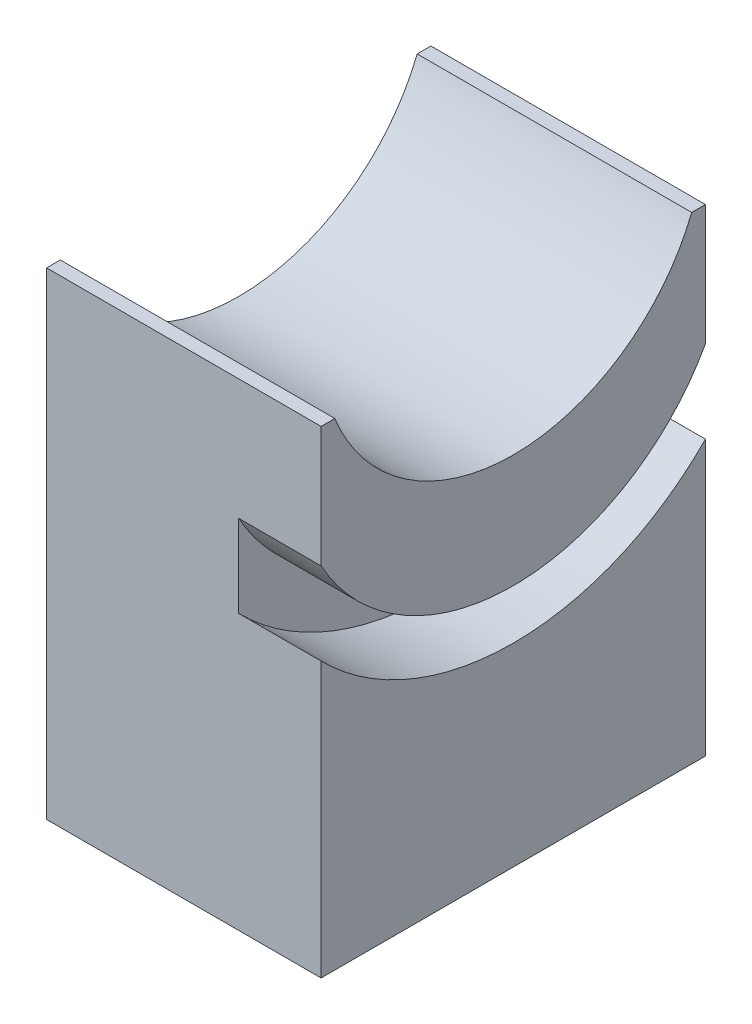
ISO-10303-21;
HEADER;
FILE_DESCRIPTION(('STEP AP214'),'2;1');
FILE_NAME('part.step','',(''),(''),'','','');
FILE_SCHEMA(('AUTOMOTIVE_DESIGN { 1 0 10303 214 1 1 1 1 }'));
ENDSEC;
DATA;
#1=APPLICATION_CONTEXT('core data for automotive mechanical design processes');
#2=APPLICATION_PROTOCOL_DEFINITION('international standard','automotive_design',2000,#1);
#3=PRODUCT_CONTEXT('',#1,'mechanical');
#4=PRODUCT('Part','Part','',(#3));
#5=PRODUCT_RELATED_PRODUCT_CATEGORY('part','',(#4));
#6=PRODUCT_DEFINITION_FORMATION('','',#4);
#7=PRODUCT_DEFINITION_CONTEXT('part definition',#1,'design');
#8=PRODUCT_DEFINITION('design','',#6,#7);
#9=PRODUCT_DEFINITION_SHAPE('','',#8);
#10=(LENGTH_UNIT() NAMED_UNIT(*) SI_UNIT(.MILLI.,.METRE.));
#11=(NAMED_UNIT(*) PLANE_ANGLE_UNIT() SI_UNIT($,.RADIAN.));
#12=(NAMED_UNIT(*) SI_UNIT($,.STERADIAN.) SOLID_ANGLE_UNIT());
#13=UNCERTAINTY_MEASURE_WITH_UNIT(LENGTH_MEASURE(1.E-05),#10,'distance_accuracy_value','');
#14=(GEOMETRIC_REPRESENTATION_CONTEXT(3) GLOBAL_UNCERTAINTY_ASSIGNED_CONTEXT((#13)) GLOBAL_UNIT_ASSIGNED_CONTEXT((#10,
#11,#12)) REPRESENTATION_CONTEXT('',''));
#15=CARTESIAN_POINT('',(0.,0.,0.));
#16=DIRECTION('',(0.,0.,1.));
#17=DIRECTION('',(1.,0.,0.));
#18=AXIS2_PLACEMENT_3D('',#15,#16,#17);
#19=CARTESIAN_POINT('',(0.,40.,14.));
#20=DIRECTION('',(-1.,0.,0.));
#21=DIRECTION('',(0.,0.,1.));
#22=AXIS2_PLACEMENT_3D('',#19,#20,#21);
#23=PLANE('',#22);
#24=DIRECTION('',(0.,-1.,0.));
#25=VECTOR('',#24,1.);
#26=CARTESIAN_POINT('',(0.,34.8038475772934,28.));
#27=LINE('',#26,#25);
#28=CARTESIAN_POINT('',(0.,34.8038475772934,28.));
#29=VERTEX_POINT('',#28);
#30=CARTESIAN_POINT('',(0.,26.,28.));
#31=VERTEX_POINT('',#30);
#32=EDGE_CURVE('E112',#29,#31,#27,.T.);
#33=ORIENTED_EDGE('',*,*,#32,.T.);
#34=CARTESIAN_POINT('',(0.,33.7459666924148,14.));
#35=DIRECTION('',(-1.,0.,0.));
#36=DIRECTION('',(0.,0.,-1.));
#37=AXIS2_PLACEMENT_3D('',#34,#35,#36);
#38=CIRCLE('',#37,16.);
#39=CARTESIAN_POINT('',(0.,26.,0.));
#40=VERTEX_POINT('',#39);
#41=EDGE_CURVE('E162',#40,#31,#38,.T.);
#42=ORIENTED_EDGE('',*,*,#41,.F.);
#43=DIRECTION('',(0.,1.,0.));
#44=VECTOR('',#43,1.);
#45=CARTESIAN_POINT('',(0.,34.8038475772934,0.));
#46=LINE('',#45,#44);
#47=CARTESIAN_POINT('',(0.,34.8038475772934,0.));
#48=VERTEX_POINT('',#47);
#49=EDGE_CURVE('E139',#40,#48,#46,.T.);
#50=ORIENTED_EDGE('',*,*,#49,.T.);
#51=DIRECTION('',(0.,0.,1.));
#52=VECTOR('',#51,1.);
#53=CARTESIAN_POINT('',(0.,34.8038475772934,1.));
#54=LINE('',#53,#52);
#55=CARTESIAN_POINT('',(0.,34.8038475772934,0.999999999999999));
#56=VERTEX_POINT('',#55);
#57=EDGE_CURVE('E138',#48,#56,#54,.T.);
#58=ORIENTED_EDGE('',*,*,#57,.T.);
#59=CARTESIAN_POINT('',(0.,40.,14.));
#60=DIRECTION('',(-1.,0.,0.));
#61=DIRECTION('',(0.,0.,1.));
#62=AXIS2_PLACEMENT_3D('',#59,#60,#61);
#63=CIRCLE('',#62,14.);
#64=CARTESIAN_POINT('',(0.,34.8038475772934,27.));
#65=VERTEX_POINT('',#64);
#66=EDGE_CURVE('E142',#56,#65,#63,.T.);
#67=ORIENTED_EDGE('',*,*,#66,.T.);
#68=DIRECTION('',(0.,0.,1.));
#69=VECTOR('',#68,1.);
#70=CARTESIAN_POINT('',(0.,34.8038475772934,27.));
#71=LINE('',#70,#69);
#72=EDGE_CURVE('E145',#65,#29,#71,.T.);
#73=ORIENTED_EDGE('',*,*,#72,.T.);
#74=EDGE_LOOP('',(#33,#42,#50,#58,#67,#73));
#75=FACE_BOUND('',#74,.T.);
#76=ADVANCED_FACE('F33',(#75),#23,.F.);
#77=CARTESIAN_POINT('',(-20.,34.8038475772934,0.));
#78=DIRECTION('',(0.,0.,-1.));
#79=DIRECTION('',(0.,1.,0.));
#80=AXIS2_PLACEMENT_3D('',#77,#78,#79);
#81=PLANE('',#80);
#82=DIRECTION('',(1.,0.,0.));
#83=VECTOR('',#82,1.);
#84=CARTESIAN_POINT('',(-6.,26.,0.));
#85=LINE('',#84,#83);
#86=CARTESIAN_POINT('',(-6.,26.,0.));
#87=VERTEX_POINT('',#86);
#88=EDGE_CURVE('E163',#87,#40,#85,.T.);
#89=ORIENTED_EDGE('',*,*,#88,.F.);
#90=DIRECTION('',(0.,1.,0.));
#91=VECTOR('',#90,1.);
#92=CARTESIAN_POINT('',(-6.,26.,0.));
#93=LINE('',#92,#91);
#94=CARTESIAN_POINT('',(-6.,20.,0.));
#95=VERTEX_POINT('',#94);
#96=EDGE_CURVE('E178',#95,#87,#93,.T.);
#97=ORIENTED_EDGE('',*,*,#96,.F.);
#98=DIRECTION('',(1.,0.,0.));
#99=VECTOR('',#98,1.);
#100=CARTESIAN_POINT('',(-6.,20.,0.));
#101=LINE('',#100,#99);
#102=CARTESIAN_POINT('',(0.,20.,0.));
#103=VERTEX_POINT('',#102);
#104=EDGE_CURVE('E165',#95,#103,#101,.T.);
#105=ORIENTED_EDGE('',*,*,#104,.T.);
#106=CARTESIAN_POINT('',(0.,0.,0.));
#107=VERTEX_POINT('',#106);
#108=EDGE_CURVE('E135',#107,#103,#46,.T.);
#109=ORIENTED_EDGE('',*,*,#108,.F.);
#110=DIRECTION('',(1.,0.,0.));
#111=VECTOR('',#110,1.);
#112=CARTESIAN_POINT('',(-20.,0.,0.));
#113=LINE('',#112,#111);
#114=CARTESIAN_POINT('',(-20.,0.,0.));
#115=VERTEX_POINT('',#114);
#116=EDGE_CURVE('E11',#115,#107,#113,.T.);
#117=ORIENTED_EDGE('',*,*,#116,.F.);
#118=DIRECTION('',(0.,1.,0.));
#119=VECTOR('',#118,1.);
#120=CARTESIAN_POINT('',(-20.,34.8038475772934,0.));
#121=LINE('',#120,#119);
#122=CARTESIAN_POINT('',(-20.,34.8038475772934,0.));
#123=VERTEX_POINT('',#122);
#124=EDGE_CURVE('E151',#115,#123,#121,.T.);
#125=ORIENTED_EDGE('',*,*,#124,.T.);
#126=DIRECTION('',(1.,0.,0.));
#127=VECTOR('',#126,1.);
#128=CARTESIAN_POINT('',(-20.,34.8038475772934,0.));
#129=LINE('',#128,#127);
#130=EDGE_CURVE('E37',#123,#48,#129,.T.);
#131=ORIENTED_EDGE('',*,*,#130,.T.);
#132=ORIENTED_EDGE('',*,*,#49,.F.);
#133=EDGE_LOOP('',(#89,#97,#105,#109,#117,#125,#131,#132));
#134=FACE_BOUND('',#133,.T.);
#135=ADVANCED_FACE('F35',(#134),#81,.T.);
#136=CARTESIAN_POINT('',(-20.,0.,0.));
#137=DIRECTION('',(0.,-1.,0.));
#138=DIRECTION('',(0.,0.,-1.));
#139=AXIS2_PLACEMENT_3D('',#136,#137,#138);
#140=PLANE('',#139);
#141=DIRECTION('',(0.,0.,-1.));
#142=VECTOR('',#141,1.);
#143=CARTESIAN_POINT('',(0.,0.,0.));
#144=LINE('',#143,#142);
#145=CARTESIAN_POINT('',(0.,0.,28.));
#146=VERTEX_POINT('',#145);
#147=EDGE_CURVE('E149',#146,#107,#144,.T.);
#148=ORIENTED_EDGE('',*,*,#147,.F.);
#149=DIRECTION('',(1.,0.,0.));
#150=VECTOR('',#149,1.);
#151=CARTESIAN_POINT('',(-20.,0.,28.));
#152=LINE('',#151,#150);
#153=CARTESIAN_POINT('',(-20.,0.,28.));
#154=VERTEX_POINT('',#153);
#155=EDGE_CURVE('E42',#154,#146,#152,.T.);
#156=ORIENTED_EDGE('',*,*,#155,.F.);
#157=DIRECTION('',(0.,0.,-1.));
#158=VECTOR('',#157,1.);
#159=CARTESIAN_POINT('',(-20.,0.,0.));
#160=LINE('',#159,#158);
#161=EDGE_CURVE('E125',#154,#115,#160,.T.);
#162=ORIENTED_EDGE('',*,*,#161,.T.);
#163=ORIENTED_EDGE('',*,*,#116,.T.);
#164=EDGE_LOOP('',(#148,#156,#162,#163));
#165=FACE_BOUND('',#164,.T.);
#166=ADVANCED_FACE('F213',(#165),#140,.T.);
#167=CARTESIAN_POINT('',(-20.,34.8038475772934,28.));
#168=DIRECTION('',(0.,0.,1.));
#169=DIRECTION('',(0.,-1.,0.));
#170=AXIS2_PLACEMENT_3D('',#167,#168,#169);
#171=PLANE('',#170);
#172=DIRECTION('',(1.,0.,0.));
#173=VECTOR('',#172,1.);
#174=CARTESIAN_POINT('',(-6.,26.,28.));
#175=LINE('',#174,#173);
#176=CARTESIAN_POINT('',(-6.,26.,28.));
#177=VERTEX_POINT('',#176);
#178=EDGE_CURVE('E176',#177,#31,#175,.T.);
#179=ORIENTED_EDGE('',*,*,#178,.T.);
#180=ORIENTED_EDGE('',*,*,#32,.F.);
#181=DIRECTION('',(1.,0.,0.));
#182=VECTOR('',#181,1.);
#183=CARTESIAN_POINT('',(-20.,34.8038475772934,28.));
#184=LINE('',#183,#182);
#185=CARTESIAN_POINT('',(-20.,34.8038475772934,28.));
#186=VERTEX_POINT('',#185);
#187=EDGE_CURVE('E104',#186,#29,#184,.T.);
#188=ORIENTED_EDGE('',*,*,#187,.F.);
#189=DIRECTION('',(0.,-1.,0.));
#190=VECTOR('',#189,1.);
#191=CARTESIAN_POINT('',(-20.,34.8038475772934,28.));
#192=LINE('',#191,#190);
#193=EDGE_CURVE('E109',#186,#154,#192,.T.);
#194=ORIENTED_EDGE('',*,*,#193,.T.);
#195=ORIENTED_EDGE('',*,*,#155,.T.);
#196=CARTESIAN_POINT('',(0.,20.,28.));
#197=VERTEX_POINT('',#196);
#198=EDGE_CURVE('E147',#197,#146,#27,.T.);
#199=ORIENTED_EDGE('',*,*,#198,.F.);
#200=DIRECTION('',(1.,0.,0.));
#201=VECTOR('',#200,1.);
#202=CARTESIAN_POINT('',(-6.,20.,28.));
#203=LINE('',#202,#201);
#204=CARTESIAN_POINT('',(-6.,20.,28.));
#205=VERTEX_POINT('',#204);
#206=EDGE_CURVE('E50',#205,#197,#203,.T.);
#207=ORIENTED_EDGE('',*,*,#206,.F.);
#208=DIRECTION('',(0.,-1.,0.));
#209=VECTOR('',#208,1.);
#210=CARTESIAN_POINT('',(-6.,20.,28.));
#211=LINE('',#210,#209);
#212=EDGE_CURVE('E202',#177,#205,#211,.T.);
#213=ORIENTED_EDGE('',*,*,#212,.F.);
#214=EDGE_LOOP('',(#179,#180,#188,#194,#195,#199,#207,#213));
#215=FACE_BOUND('',#214,.T.);
#216=ADVANCED_FACE('F107',(#215),#171,.T.);
#217=CARTESIAN_POINT('',(-20.,34.8038475772934,27.));
#218=DIRECTION('',(0.,1.,0.));
#219=DIRECTION('',(0.,0.,1.));
#220=AXIS2_PLACEMENT_3D('',#217,#218,#219);
#221=PLANE('',#220);
#222=ORIENTED_EDGE('',*,*,#72,.F.);
#223=DIRECTION('',(1.,0.,0.));
#224=VECTOR('',#223,1.);
#225=CARTESIAN_POINT('',(-20.,34.8038475772934,27.));
#226=LINE('',#225,#224);
#227=CARTESIAN_POINT('',(-20.,34.8038475772934,27.));
#228=VERTEX_POINT('',#227);
#229=EDGE_CURVE('E117',#228,#65,#226,.T.);
#230=ORIENTED_EDGE('',*,*,#229,.F.);
#231=DIRECTION('',(0.,0.,1.));
#232=VECTOR('',#231,1.);
#233=CARTESIAN_POINT('',(-20.,34.8038475772934,27.));
#234=LINE('',#233,#232);
#235=EDGE_CURVE('E123',#228,#186,#234,.T.);
#236=ORIENTED_EDGE('',*,*,#235,.T.);
#237=ORIENTED_EDGE('',*,*,#187,.T.);
#238=EDGE_LOOP('',(#222,#230,#236,#237));
#239=FACE_BOUND('',#238,.T.);
#240=ADVANCED_FACE('F127',(#239),#221,.T.);
#241=CARTESIAN_POINT('',(-20.,40.,14.));
#242=DIRECTION('',(1.,0.,0.));
#243=DIRECTION('',(0.,0.,-1.));
#244=AXIS2_PLACEMENT_3D('',#241,#242,#243);
#245=CYLINDRICAL_SURFACE('',#244,14.);
#246=ORIENTED_EDGE('',*,*,#66,.F.);
#247=DIRECTION('',(1.,0.,0.));
#248=VECTOR('',#247,1.);
#249=CARTESIAN_POINT('',(-20.,34.8038475772934,0.999999999999999));
#250=LINE('',#249,#248);
#251=CARTESIAN_POINT('',(-20.,34.8038475772934,0.999999999999999));
#252=VERTEX_POINT('',#251);
#253=EDGE_CURVE('E154',#252,#56,#250,.T.);
#254=ORIENTED_EDGE('',*,*,#253,.F.);
#255=CARTESIAN_POINT('',(-20.,40.,14.));
#256=DIRECTION('',(-1.,0.,0.));
#257=DIRECTION('',(0.,0.,1.));
#258=AXIS2_PLACEMENT_3D('',#255,#256,#257);
#259=CIRCLE('',#258,14.);
#260=EDGE_CURVE('E128',#252,#228,#259,.T.);
#261=ORIENTED_EDGE('',*,*,#260,.T.);
#262=ORIENTED_EDGE('',*,*,#229,.T.);
#263=EDGE_LOOP('',(#246,#254,#261,#262));
#264=FACE_BOUND('',#263,.T.);
#265=ADVANCED_FACE('F180',(#264),#245,.F.);
#266=CARTESIAN_POINT('',(-20.,34.8038475772934,1.));
#267=DIRECTION('',(0.,1.,0.));
#268=DIRECTION('',(0.,0.,1.));
#269=AXIS2_PLACEMENT_3D('',#266,#267,#268);
#270=PLANE('',#269);
#271=ORIENTED_EDGE('',*,*,#57,.F.);
#272=ORIENTED_EDGE('',*,*,#130,.F.);
#273=DIRECTION('',(0.,0.,1.));
#274=VECTOR('',#273,1.);
#275=CARTESIAN_POINT('',(-20.,34.8038475772934,1.));
#276=LINE('',#275,#274);
#277=EDGE_CURVE('E130',#123,#252,#276,.T.);
#278=ORIENTED_EDGE('',*,*,#277,.T.);
#279=ORIENTED_EDGE('',*,*,#253,.T.);
#280=EDGE_LOOP('',(#271,#272,#278,#279));
#281=FACE_BOUND('',#280,.T.);
#282=ADVANCED_FACE('F158',(#281),#270,.T.);
#283=CARTESIAN_POINT('',(-20.,40.,14.));
#284=DIRECTION('',(-1.,0.,0.));
#285=DIRECTION('',(0.,0.,1.));
#286=AXIS2_PLACEMENT_3D('',#283,#284,#285);
#287=PLANE('',#286);
#288=ORIENTED_EDGE('',*,*,#124,.F.);
#289=ORIENTED_EDGE('',*,*,#161,.F.);
#290=ORIENTED_EDGE('',*,*,#193,.F.);
#291=ORIENTED_EDGE('',*,*,#235,.F.);
#292=ORIENTED_EDGE('',*,*,#260,.F.);
#293=ORIENTED_EDGE('',*,*,#277,.F.);
#294=EDGE_LOOP('',(#288,#289,#290,#291,#292,#293));
#295=FACE_BOUND('',#294,.T.);
#296=ADVANCED_FACE('F121',(#295),#287,.T.);
#297=ORIENTED_EDGE('',*,*,#108,.T.);
#298=CARTESIAN_POINT('',(0.,33.7459666924148,14.));
#299=DIRECTION('',(1.,0.,0.));
#300=DIRECTION('',(0.,0.,-1.));
#301=AXIS2_PLACEMENT_3D('',#298,#299,#300);
#302=CIRCLE('',#301,19.6201834932545);
#303=EDGE_CURVE('E172',#197,#103,#302,.T.);
#304=ORIENTED_EDGE('',*,*,#303,.F.);
#305=ORIENTED_EDGE('',*,*,#198,.T.);
#306=ORIENTED_EDGE('',*,*,#147,.T.);
#307=EDGE_LOOP('',(#297,#304,#305,#306));
#308=FACE_BOUND('',#307,.T.);
#309=ADVANCED_FACE('F212',(#308),#23,.F.);
#310=CARTESIAN_POINT('',(-6.,33.7459666924148,14.));
#311=DIRECTION('',(1.,0.,0.));
#312=DIRECTION('',(0.,0.,-1.));
#313=AXIS2_PLACEMENT_3D('',#310,#311,#312);
#314=CYLINDRICAL_SURFACE('',#313,16.);
#315=ORIENTED_EDGE('',*,*,#41,.T.);
#316=ORIENTED_EDGE('',*,*,#178,.F.);
#317=CARTESIAN_POINT('',(-6.,33.7459666924148,14.));
#318=DIRECTION('',(-1.,0.,0.));
#319=DIRECTION('',(0.,0.,-1.));
#320=AXIS2_PLACEMENT_3D('',#317,#318,#319);
#321=CIRCLE('',#320,16.);
#322=EDGE_CURVE('E195',#87,#177,#321,.T.);
#323=ORIENTED_EDGE('',*,*,#322,.F.);
#324=ORIENTED_EDGE('',*,*,#88,.T.);
#325=EDGE_LOOP('',(#315,#316,#323,#324));
#326=FACE_BOUND('',#325,.T.);
#327=ADVANCED_FACE('F194',(#326),#314,.T.);
#328=CARTESIAN_POINT('',(-6.,33.7459666924148,14.));
#329=DIRECTION('',(1.,0.,0.));
#330=DIRECTION('',(0.,0.,-1.));
#331=AXIS2_PLACEMENT_3D('',#328,#329,#330);
#332=CYLINDRICAL_SURFACE('',#331,19.6201834932545);
#333=ORIENTED_EDGE('',*,*,#303,.T.);
#334=ORIENTED_EDGE('',*,*,#104,.F.);
#335=CARTESIAN_POINT('',(-6.,33.7459666924148,14.));
#336=DIRECTION('',(1.,0.,0.));
#337=DIRECTION('',(0.,0.,-1.));
#338=AXIS2_PLACEMENT_3D('',#335,#336,#337);
#339=CIRCLE('',#338,19.6201834932545);
#340=EDGE_CURVE('E206',#205,#95,#339,.T.);
#341=ORIENTED_EDGE('',*,*,#340,.F.);
#342=ORIENTED_EDGE('',*,*,#206,.T.);
#343=EDGE_LOOP('',(#333,#334,#341,#342));
#344=FACE_BOUND('',#343,.T.);
#345=ADVANCED_FACE('F210',(#344),#332,.F.);
#346=CARTESIAN_POINT('',(-6.,33.7459666924148,14.));
#347=DIRECTION('',(1.,0.,0.));
#348=DIRECTION('',(0.,0.,-1.));
#349=AXIS2_PLACEMENT_3D('',#346,#347,#348);
#350=PLANE('',#349);
#351=ORIENTED_EDGE('',*,*,#322,.T.);
#352=ORIENTED_EDGE('',*,*,#212,.T.);
#353=ORIENTED_EDGE('',*,*,#340,.T.);
#354=ORIENTED_EDGE('',*,*,#96,.T.);
#355=EDGE_LOOP('',(#351,#352,#353,#354));
#356=FACE_BOUND('',#355,.T.);
#357=ADVANCED_FACE('F200',(#356),#350,.T.);
#358=CLOSED_SHELL('',(#76,#135,#166,#216,#240,#265,#282,#296,#309,#327,#345,#357));
#359=MANIFOLD_SOLID_BREP('B2',#358);
#360=ADVANCED_BREP_SHAPE_REPRESENTATION('',(#18,#359),#14);
#361=SHAPE_DEFINITION_REPRESENTATION(#9,#360);
ENDSEC;
END-ISO-10303-21;
